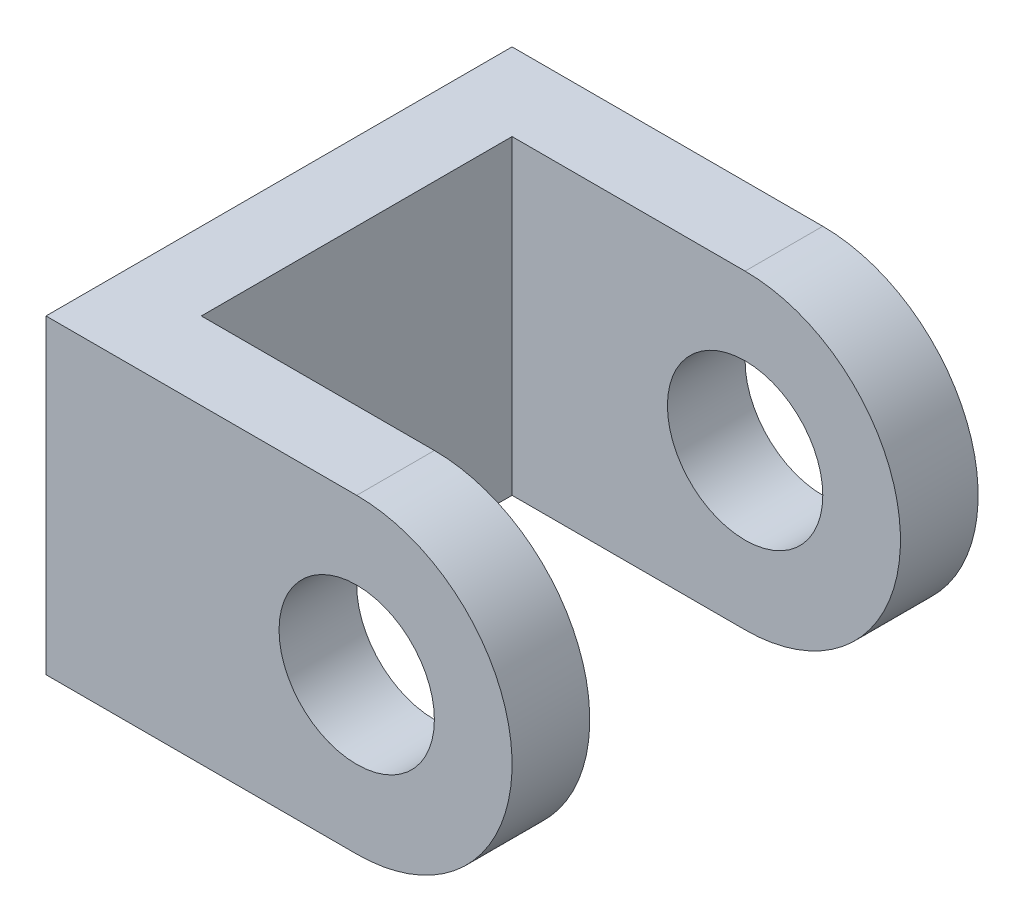
ISO-10303-21;
HEADER;
FILE_DESCRIPTION(('STEP AP214'),'2;1');
FILE_NAME('part.step','',(''),(''),'','','');
FILE_SCHEMA(('AUTOMOTIVE_DESIGN { 1 0 10303 214 1 1 1 1 }'));
ENDSEC;
DATA;
#1=APPLICATION_CONTEXT('core data for automotive mechanical design processes');
#2=APPLICATION_PROTOCOL_DEFINITION('international standard','automotive_design',2000,#1);
#3=PRODUCT_CONTEXT('',#1,'mechanical');
#4=PRODUCT('Part','Part','',(#3));
#5=PRODUCT_RELATED_PRODUCT_CATEGORY('part','',(#4));
#6=PRODUCT_DEFINITION_FORMATION('','',#4);
#7=PRODUCT_DEFINITION_CONTEXT('part definition',#1,'design');
#8=PRODUCT_DEFINITION('design','',#6,#7);
#9=PRODUCT_DEFINITION_SHAPE('','',#8);
#10=(LENGTH_UNIT() NAMED_UNIT(*) SI_UNIT(.MILLI.,.METRE.));
#11=(NAMED_UNIT(*) PLANE_ANGLE_UNIT() SI_UNIT($,.RADIAN.));
#12=(NAMED_UNIT(*) SI_UNIT($,.STERADIAN.) SOLID_ANGLE_UNIT());
#13=UNCERTAINTY_MEASURE_WITH_UNIT(LENGTH_MEASURE(1.E-05),#10,'distance_accuracy_value','');
#14=(GEOMETRIC_REPRESENTATION_CONTEXT(3) GLOBAL_UNCERTAINTY_ASSIGNED_CONTEXT((#13)) GLOBAL_UNIT_ASSIGNED_CONTEXT((#10,
#11,#12)) REPRESENTATION_CONTEXT('',''));
#15=CARTESIAN_POINT('',(0.,0.,0.));
#16=DIRECTION('',(0.,0.,1.));
#17=DIRECTION('',(1.,0.,0.));
#18=AXIS2_PLACEMENT_3D('',#15,#16,#17);
#19=CARTESIAN_POINT('',(10.,0.,-30.));
#20=DIRECTION('',(0.,0.,1.));
#21=DIRECTION('',(1.,0.,0.));
#22=AXIS2_PLACEMENT_3D('',#19,#20,#21);
#23=CYLINDRICAL_SURFACE('',#22,10.);
#24=CARTESIAN_POINT('',(10.,0.,-5.));
#25=DIRECTION('',(0.,0.,1.));
#26=DIRECTION('',(0.,-1.,0.));
#27=AXIS2_PLACEMENT_3D('',#24,#25,#26);
#28=CIRCLE('',#27,10.);
#29=CARTESIAN_POINT('',(9.99999999999999,10.,-5.));
#30=VERTEX_POINT('',#29);
#31=CARTESIAN_POINT('',(10.,-10.,-5.));
#32=VERTEX_POINT('',#31);
#33=EDGE_CURVE('E136',#30,#32,#28,.F.);
#34=ORIENTED_EDGE('',*,*,#33,.F.);
#35=DIRECTION('',(0.,0.,1.));
#36=VECTOR('',#35,1.);
#37=CARTESIAN_POINT('',(10.,10.,-30.));
#38=LINE('',#37,#36);
#39=CARTESIAN_POINT('',(10.,10.,0.));
#40=VERTEX_POINT('',#39);
#41=EDGE_CURVE('E128',#30,#40,#38,.T.);
#42=ORIENTED_EDGE('',*,*,#41,.T.);
#43=CARTESIAN_POINT('',(10.,0.,0.));
#44=DIRECTION('',(0.,0.,1.));
#45=DIRECTION('',(-1.,0.,0.));
#46=AXIS2_PLACEMENT_3D('',#43,#44,#45);
#47=CIRCLE('',#46,10.);
#48=CARTESIAN_POINT('',(10.,-10.,0.));
#49=VERTEX_POINT('',#48);
#50=EDGE_CURVE('E145',#49,#40,#47,.T.);
#51=ORIENTED_EDGE('',*,*,#50,.F.);
#52=DIRECTION('',(0.,0.,1.));
#53=VECTOR('',#52,1.);
#54=CARTESIAN_POINT('',(10.,-10.,-30.));
#55=LINE('',#54,#53);
#56=EDGE_CURVE('E42',#32,#49,#55,.T.);
#57=ORIENTED_EDGE('',*,*,#56,.F.);
#58=EDGE_LOOP('',(#34,#42,#51,#57));
#59=FACE_BOUND('',#58,.T.);
#60=ADVANCED_FACE('F33',(#59),#23,.T.);
#61=CARTESIAN_POINT('',(10.,0.,-30.));
#62=DIRECTION('',(0.,0.,1.));
#63=DIRECTION('',(1.,0.,0.));
#64=AXIS2_PLACEMENT_3D('',#61,#62,#63);
#65=CYLINDRICAL_SURFACE('',#64,5.);
#66=CARTESIAN_POINT('',(10.,0.,-25.));
#67=DIRECTION('',(0.,0.,-1.));
#68=DIRECTION('',(0.,1.,0.));
#69=AXIS2_PLACEMENT_3D('',#66,#67,#68);
#70=CIRCLE('',#69,5.);
#71=CARTESIAN_POINT('',(10.,5.,-25.));
#72=VERTEX_POINT('',#71);
#73=EDGE_CURVE('E37',#72,#72,#70,.F.);
#74=ORIENTED_EDGE('',*,*,#73,.T.);
#75=EDGE_LOOP('',(#74));
#76=FACE_BOUND('',#75,.T.);
#77=CARTESIAN_POINT('',(10.,0.,-30.));
#78=DIRECTION('',(0.,0.,1.));
#79=DIRECTION('',(1.,0.,0.));
#80=AXIS2_PLACEMENT_3D('',#77,#78,#79);
#81=CIRCLE('',#80,5.);
#82=CARTESIAN_POINT('',(15.,0.,-30.));
#83=VERTEX_POINT('',#82);
#84=EDGE_CURVE('E142',#83,#83,#81,.T.);
#85=ORIENTED_EDGE('',*,*,#84,.F.);
#86=EDGE_LOOP('',(#85));
#87=FACE_BOUND('',#86,.T.);
#88=ADVANCED_FACE('F193',(#76,#87),#65,.F.);
#89=CARTESIAN_POINT('',(10.,0.,-25.));
#90=DIRECTION('',(0.,0.,-1.));
#91=DIRECTION('',(0.,1.,0.));
#92=AXIS2_PLACEMENT_3D('',#89,#90,#91);
#93=CIRCLE('',#92,10.);
#94=CARTESIAN_POINT('',(10.,-10.,-25.));
#95=VERTEX_POINT('',#94);
#96=CARTESIAN_POINT('',(9.99999999999999,10.,-25.));
#97=VERTEX_POINT('',#96);
#98=EDGE_CURVE('E139',#95,#97,#93,.F.);
#99=ORIENTED_EDGE('',*,*,#98,.F.);
#100=CARTESIAN_POINT('',(10.,-10.,-30.));
#101=VERTEX_POINT('',#100);
#102=EDGE_CURVE('E11',#101,#95,#55,.T.);
#103=ORIENTED_EDGE('',*,*,#102,.F.);
#104=CARTESIAN_POINT('',(10.,0.,-30.));
#105=DIRECTION('',(0.,0.,1.));
#106=DIRECTION('',(-1.,0.,0.));
#107=AXIS2_PLACEMENT_3D('',#104,#105,#106);
#108=CIRCLE('',#107,10.);
#109=CARTESIAN_POINT('',(10.,10.,-30.));
#110=VERTEX_POINT('',#109);
#111=EDGE_CURVE('E148',#101,#110,#108,.T.);
#112=ORIENTED_EDGE('',*,*,#111,.T.);
#113=EDGE_CURVE('E87',#110,#97,#38,.T.);
#114=ORIENTED_EDGE('',*,*,#113,.T.);
#115=EDGE_LOOP('',(#99,#103,#112,#114));
#116=FACE_BOUND('',#115,.T.);
#117=ADVANCED_FACE('F35',(#116),#23,.T.);
#118=CARTESIAN_POINT('',(-10.,-10.,-30.));
#119=DIRECTION('',(0.,-1.,0.));
#120=DIRECTION('',(0.,0.,-1.));
#121=AXIS2_PLACEMENT_3D('',#118,#119,#120);
#122=PLANE('',#121);
#123=DIRECTION('',(1.,0.,0.));
#124=VECTOR('',#123,1.);
#125=CARTESIAN_POINT('',(-5.,-10.,-25.));
#126=LINE('',#125,#124);
#127=CARTESIAN_POINT('',(-5.,-10.,-25.));
#128=VERTEX_POINT('',#127);
#129=EDGE_CURVE('E131',#128,#95,#126,.T.);
#130=ORIENTED_EDGE('',*,*,#129,.F.);
#131=DIRECTION('',(0.,0.,-1.));
#132=VECTOR('',#131,1.);
#133=CARTESIAN_POINT('',(-5.,-10.,-25.));
#134=LINE('',#133,#132);
#135=CARTESIAN_POINT('',(-5.,-10.,-5.));
#136=VERTEX_POINT('',#135);
#137=EDGE_CURVE('E119',#136,#128,#134,.T.);
#138=ORIENTED_EDGE('',*,*,#137,.F.);
#139=DIRECTION('',(1.,0.,0.));
#140=VECTOR('',#139,1.);
#141=CARTESIAN_POINT('',(-5.,-10.,-5.));
#142=LINE('',#141,#140);
#143=EDGE_CURVE('E117',#136,#32,#142,.T.);
#144=ORIENTED_EDGE('',*,*,#143,.T.);
#145=ORIENTED_EDGE('',*,*,#56,.T.);
#146=DIRECTION('',(1.,0.,0.));
#147=VECTOR('',#146,1.);
#148=CARTESIAN_POINT('',(-10.,-10.,0.));
#149=LINE('',#148,#147);
#150=CARTESIAN_POINT('',(-10.,-10.,0.));
#151=VERTEX_POINT('',#150);
#152=EDGE_CURVE('E151',#151,#49,#149,.T.);
#153=ORIENTED_EDGE('',*,*,#152,.F.);
#154=DIRECTION('',(0.,0.,1.));
#155=VECTOR('',#154,1.);
#156=CARTESIAN_POINT('',(-10.,-10.,-30.));
#157=LINE('',#156,#155);
#158=CARTESIAN_POINT('',(-10.,-10.,-30.));
#159=VERTEX_POINT('',#158);
#160=EDGE_CURVE('E169',#159,#151,#157,.T.);
#161=ORIENTED_EDGE('',*,*,#160,.F.);
#162=DIRECTION('',(1.,0.,0.));
#163=VECTOR('',#162,1.);
#164=CARTESIAN_POINT('',(-10.,-10.,-30.));
#165=LINE('',#164,#163);
#166=EDGE_CURVE('E156',#159,#101,#165,.T.);
#167=ORIENTED_EDGE('',*,*,#166,.T.);
#168=ORIENTED_EDGE('',*,*,#102,.T.);
#169=EDGE_LOOP('',(#130,#138,#144,#145,#153,#161,#167,#168));
#170=FACE_BOUND('',#169,.T.);
#171=ADVANCED_FACE('F180',(#170),#122,.T.);
#172=CARTESIAN_POINT('',(-10.,10.,-30.));
#173=DIRECTION('',(-1.,0.,0.));
#174=DIRECTION('',(0.,-1.,0.));
#175=AXIS2_PLACEMENT_3D('',#172,#173,#174);
#176=PLANE('',#175);
#177=DIRECTION('',(0.,-1.,0.));
#178=VECTOR('',#177,1.);
#179=CARTESIAN_POINT('',(-10.,10.,0.));
#180=LINE('',#179,#178);
#181=CARTESIAN_POINT('',(-10.,10.,0.));
#182=VERTEX_POINT('',#181);
#183=EDGE_CURVE('E164',#182,#151,#180,.T.);
#184=ORIENTED_EDGE('',*,*,#183,.F.);
#185=DIRECTION('',(0.,0.,1.));
#186=VECTOR('',#185,1.);
#187=CARTESIAN_POINT('',(-10.,10.,-30.));
#188=LINE('',#187,#186);
#189=CARTESIAN_POINT('',(-10.,10.,-30.));
#190=VERTEX_POINT('',#189);
#191=EDGE_CURVE('E171',#190,#182,#188,.T.);
#192=ORIENTED_EDGE('',*,*,#191,.F.);
#193=DIRECTION('',(0.,-1.,0.));
#194=VECTOR('',#193,1.);
#195=CARTESIAN_POINT('',(-10.,10.,-30.));
#196=LINE('',#195,#194);
#197=EDGE_CURVE('E153',#190,#159,#196,.T.);
#198=ORIENTED_EDGE('',*,*,#197,.T.);
#199=ORIENTED_EDGE('',*,*,#160,.T.);
#200=EDGE_LOOP('',(#184,#192,#198,#199));
#201=FACE_BOUND('',#200,.T.);
#202=ADVANCED_FACE('F208',(#201),#176,.T.);
#203=CARTESIAN_POINT('',(-10.,10.,-30.));
#204=DIRECTION('',(0.,1.,0.));
#205=DIRECTION('',(0.,0.,1.));
#206=AXIS2_PLACEMENT_3D('',#203,#204,#205);
#207=PLANE('',#206);
#208=DIRECTION('',(1.,0.,0.));
#209=VECTOR('',#208,1.);
#210=CARTESIAN_POINT('',(-5.,10.,-25.));
#211=LINE('',#210,#209);
#212=CARTESIAN_POINT('',(-5.,10.,-25.));
#213=VERTEX_POINT('',#212);
#214=EDGE_CURVE('E129',#213,#97,#211,.T.);
#215=ORIENTED_EDGE('',*,*,#214,.T.);
#216=ORIENTED_EDGE('',*,*,#113,.F.);
#217=DIRECTION('',(-1.,0.,0.));
#218=VECTOR('',#217,1.);
#219=CARTESIAN_POINT('',(-10.,10.,-30.));
#220=LINE('',#219,#218);
#221=EDGE_CURVE('E150',#110,#190,#220,.T.);
#222=ORIENTED_EDGE('',*,*,#221,.T.);
#223=ORIENTED_EDGE('',*,*,#191,.T.);
#224=DIRECTION('',(-1.,0.,0.));
#225=VECTOR('',#224,1.);
#226=CARTESIAN_POINT('',(-10.,10.,0.));
#227=LINE('',#226,#225);
#228=EDGE_CURVE('E161',#40,#182,#227,.T.);
#229=ORIENTED_EDGE('',*,*,#228,.F.);
#230=ORIENTED_EDGE('',*,*,#41,.F.);
#231=DIRECTION('',(1.,0.,0.));
#232=VECTOR('',#231,1.);
#233=CARTESIAN_POINT('',(-5.,10.,-5.));
#234=LINE('',#233,#232);
#235=CARTESIAN_POINT('',(-5.,10.,-5.));
#236=VERTEX_POINT('',#235);
#237=EDGE_CURVE('E115',#236,#30,#234,.T.);
#238=ORIENTED_EDGE('',*,*,#237,.F.);
#239=DIRECTION('',(0.,0.,1.));
#240=VECTOR('',#239,1.);
#241=CARTESIAN_POINT('',(-5.,10.,-25.));
#242=LINE('',#241,#240);
#243=EDGE_CURVE('E120',#213,#236,#242,.T.);
#244=ORIENTED_EDGE('',*,*,#243,.F.);
#245=EDGE_LOOP('',(#215,#216,#222,#223,#229,#230,#238,#244));
#246=FACE_BOUND('',#245,.T.);
#247=ADVANCED_FACE('F126',(#246),#207,.T.);
#248=CARTESIAN_POINT('',(10.,0.,-30.));
#249=DIRECTION('',(0.,0.,-1.));
#250=DIRECTION('',(-1.,0.,0.));
#251=AXIS2_PLACEMENT_3D('',#248,#249,#250);
#252=PLANE('',#251);
#253=ORIENTED_EDGE('',*,*,#84,.T.);
#254=EDGE_LOOP('',(#253));
#255=FACE_BOUND('',#254,.T.);
#256=ORIENTED_EDGE('',*,*,#111,.F.);
#257=ORIENTED_EDGE('',*,*,#166,.F.);
#258=ORIENTED_EDGE('',*,*,#197,.F.);
#259=ORIENTED_EDGE('',*,*,#221,.F.);
#260=EDGE_LOOP('',(#256,#257,#258,#259));
#261=FACE_BOUND('',#260,.T.);
#262=ADVANCED_FACE('F184',(#255,#261),#252,.T.);
#263=CARTESIAN_POINT('',(10.,0.,0.));
#264=DIRECTION('',(0.,0.,-1.));
#265=DIRECTION('',(-1.,0.,0.));
#266=AXIS2_PLACEMENT_3D('',#263,#264,#265);
#267=PLANE('',#266);
#268=CARTESIAN_POINT('',(10.,0.,0.));
#269=DIRECTION('',(0.,0.,1.));
#270=DIRECTION('',(1.,0.,0.));
#271=AXIS2_PLACEMENT_3D('',#268,#269,#270);
#272=CIRCLE('',#271,5.);
#273=CARTESIAN_POINT('',(15.,0.,0.));
#274=VERTEX_POINT('',#273);
#275=EDGE_CURVE('E141',#274,#274,#272,.T.);
#276=ORIENTED_EDGE('',*,*,#275,.F.);
#277=EDGE_LOOP('',(#276));
#278=FACE_BOUND('',#277,.T.);
#279=ORIENTED_EDGE('',*,*,#50,.T.);
#280=ORIENTED_EDGE('',*,*,#228,.T.);
#281=ORIENTED_EDGE('',*,*,#183,.T.);
#282=ORIENTED_EDGE('',*,*,#152,.T.);
#283=EDGE_LOOP('',(#279,#280,#281,#282));
#284=FACE_BOUND('',#283,.T.);
#285=ADVANCED_FACE('F200',(#278,#284),#267,.F.);
#286=CARTESIAN_POINT('',(10.,0.,-5.));
#287=DIRECTION('',(0.,0.,1.));
#288=DIRECTION('',(0.,-1.,0.));
#289=AXIS2_PLACEMENT_3D('',#286,#287,#288);
#290=CIRCLE('',#289,5.);
#291=CARTESIAN_POINT('',(10.,-5.,-5.));
#292=VERTEX_POINT('',#291);
#293=EDGE_CURVE('E138',#292,#292,#290,.F.);
#294=ORIENTED_EDGE('',*,*,#293,.T.);
#295=EDGE_LOOP('',(#294));
#296=FACE_BOUND('',#295,.T.);
#297=ORIENTED_EDGE('',*,*,#275,.T.);
#298=EDGE_LOOP('',(#297));
#299=FACE_BOUND('',#298,.T.);
#300=ADVANCED_FACE('F188',(#296,#299),#65,.F.);
#301=CARTESIAN_POINT('',(-5.,10.,-25.));
#302=DIRECTION('',(0.,0.,-1.));
#303=DIRECTION('',(0.,1.,0.));
#304=AXIS2_PLACEMENT_3D('',#301,#302,#303);
#305=PLANE('',#304);
#306=ORIENTED_EDGE('',*,*,#98,.T.);
#307=ORIENTED_EDGE('',*,*,#214,.F.);
#308=DIRECTION('',(0.,1.,0.));
#309=VECTOR('',#308,1.);
#310=CARTESIAN_POINT('',(-5.,10.,-25.));
#311=LINE('',#310,#309);
#312=EDGE_CURVE('E50',#128,#213,#311,.T.);
#313=ORIENTED_EDGE('',*,*,#312,.F.);
#314=ORIENTED_EDGE('',*,*,#129,.T.);
#315=EDGE_LOOP('',(#306,#307,#313,#314));
#316=FACE_BOUND('',#315,.T.);
#317=ORIENTED_EDGE('',*,*,#73,.F.);
#318=EDGE_LOOP('',(#317));
#319=FACE_BOUND('',#318,.T.);
#320=ADVANCED_FACE('F185',(#316,#319),#305,.F.);
#321=CARTESIAN_POINT('',(-5.,10.,-5.));
#322=DIRECTION('',(0.,0.,1.));
#323=DIRECTION('',(0.,-1.,0.));
#324=AXIS2_PLACEMENT_3D('',#321,#322,#323);
#325=PLANE('',#324);
#326=ORIENTED_EDGE('',*,*,#33,.T.);
#327=ORIENTED_EDGE('',*,*,#143,.F.);
#328=DIRECTION('',(0.,-1.,0.));
#329=VECTOR('',#328,1.);
#330=CARTESIAN_POINT('',(-5.,10.,-5.));
#331=LINE('',#330,#329);
#332=EDGE_CURVE('E111',#236,#136,#331,.T.);
#333=ORIENTED_EDGE('',*,*,#332,.F.);
#334=ORIENTED_EDGE('',*,*,#237,.T.);
#335=EDGE_LOOP('',(#326,#327,#333,#334));
#336=FACE_BOUND('',#335,.T.);
#337=ORIENTED_EDGE('',*,*,#293,.F.);
#338=EDGE_LOOP('',(#337));
#339=FACE_BOUND('',#338,.T.);
#340=ADVANCED_FACE('F112',(#336,#339),#325,.F.);
#341=CARTESIAN_POINT('',(-5.,0.,0.));
#342=DIRECTION('',(-1.,0.,0.));
#343=DIRECTION('',(0.,0.,1.));
#344=AXIS2_PLACEMENT_3D('',#341,#342,#343);
#345=PLANE('',#344);
#346=ORIENTED_EDGE('',*,*,#312,.T.);
#347=ORIENTED_EDGE('',*,*,#243,.T.);
#348=ORIENTED_EDGE('',*,*,#332,.T.);
#349=ORIENTED_EDGE('',*,*,#137,.T.);
#350=EDGE_LOOP('',(#346,#347,#348,#349));
#351=FACE_BOUND('',#350,.T.);
#352=ADVANCED_FACE('F123',(#351),#345,.F.);
#353=CLOSED_SHELL('',(#60,#88,#117,#171,#202,#247,#262,#285,#300,#320,#340,#352));
#354=MANIFOLD_SOLID_BREP('B2',#353);
#355=ADVANCED_BREP_SHAPE_REPRESENTATION('',(#18,#354),#14);
#356=SHAPE_DEFINITION_REPRESENTATION(#9,#355);
ENDSEC;
END-ISO-10303-21;
